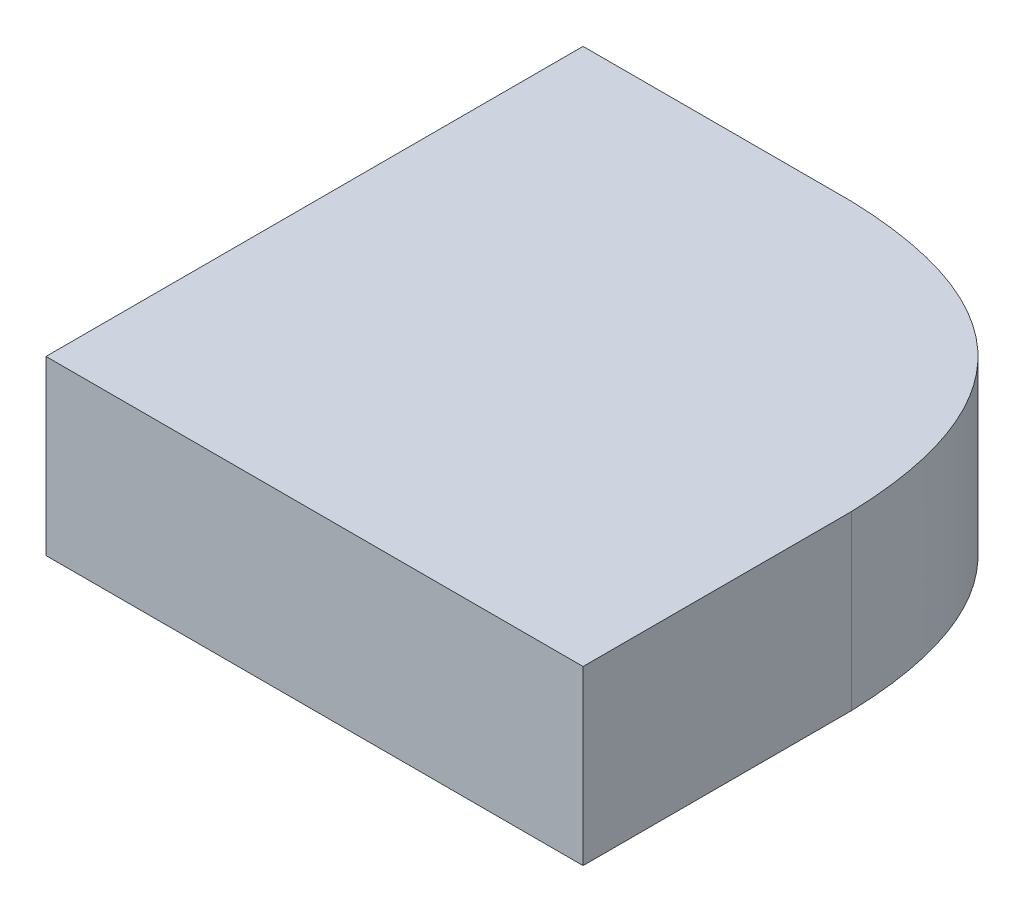
ISO-10303-21;
HEADER;
FILE_DESCRIPTION(('STEP AP214'),'2;1');
FILE_NAME('part.step','',(''),(''),'','','');
FILE_SCHEMA(('AUTOMOTIVE_DESIGN { 1 0 10303 214 1 1 1 1 }'));
ENDSEC;
DATA;
#1=APPLICATION_CONTEXT('core data for automotive mechanical design processes');
#2=APPLICATION_PROTOCOL_DEFINITION('international standard','automotive_design',2000,#1);
#3=PRODUCT_CONTEXT('',#1,'mechanical');
#4=PRODUCT('Part','Part','',(#3));
#5=PRODUCT_RELATED_PRODUCT_CATEGORY('part','',(#4));
#6=PRODUCT_DEFINITION_FORMATION('','',#4);
#7=PRODUCT_DEFINITION_CONTEXT('part definition',#1,'design');
#8=PRODUCT_DEFINITION('design','',#6,#7);
#9=PRODUCT_DEFINITION_SHAPE('','',#8);
#10=(LENGTH_UNIT() NAMED_UNIT(*) SI_UNIT(.MILLI.,.METRE.));
#11=(NAMED_UNIT(*) PLANE_ANGLE_UNIT() SI_UNIT($,.RADIAN.));
#12=(NAMED_UNIT(*) SI_UNIT($,.STERADIAN.) SOLID_ANGLE_UNIT());
#13=UNCERTAINTY_MEASURE_WITH_UNIT(LENGTH_MEASURE(1.E-05),#10,'distance_accuracy_value','');
#14=(GEOMETRIC_REPRESENTATION_CONTEXT(3) GLOBAL_UNCERTAINTY_ASSIGNED_CONTEXT((#13)) GLOBAL_UNIT_ASSIGNED_CONTEXT((#10,
#11,#12)) REPRESENTATION_CONTEXT('',''));
#15=CARTESIAN_POINT('',(0.,0.,0.));
#16=DIRECTION('',(0.,0.,1.));
#17=DIRECTION('',(1.,0.,0.));
#18=AXIS2_PLACEMENT_3D('',#15,#16,#17);
#19=CARTESIAN_POINT('',(12.4557692307692,8.,0.));
#20=CARTESIAN_POINT('',(12.0918378715965,8.,-12.0918378715965));
#21=CARTESIAN_POINT('',(0.,8.,-12.4557692307692));
#22=B_SPLINE_CURVE_WITH_KNOTS('',2,(#19,#20,#21),.UNSPECIFIED.,.F.,.F.,(3,3),(0.,1.),.UNSPECIFIED.);
#23=DIRECTION('',(0.,-1.,0.));
#24=VECTOR('',#23,1.);
#25=SURFACE_OF_LINEAR_EXTRUSION('',#22,#24);
#26=CARTESIAN_POINT('',(12.4557692307692,0.,0.));
#27=CARTESIAN_POINT('',(12.0918378715965,0.,-12.0918378715965));
#28=CARTESIAN_POINT('',(0.,0.,-12.4557692307692));
#29=B_SPLINE_CURVE_WITH_KNOTS('',2,(#26,#27,#28),.UNSPECIFIED.,.F.,.F.,(3,3),(0.,1.),.UNSPECIFIED.);
#30=CARTESIAN_POINT('',(12.4557692307692,0.,0.));
#31=VERTEX_POINT('',#30);
#32=CARTESIAN_POINT('',(0.,0.,-12.4557692307692));
#33=VERTEX_POINT('',#32);
#34=EDGE_CURVE('E123',#31,#33,#29,.T.);
#35=ORIENTED_EDGE('',*,*,#34,.T.);
#36=DIRECTION('',(0.,-1.,0.));
#37=VECTOR('',#36,1.);
#38=CARTESIAN_POINT('',(0.,8.,-12.4557692307692));
#39=LINE('',#38,#37);
#40=CARTESIAN_POINT('',(0.,8.,-12.4557692307692));
#41=VERTEX_POINT('',#40);
#42=EDGE_CURVE('E11',#41,#33,#39,.T.);
#43=ORIENTED_EDGE('',*,*,#42,.F.);
#44=CARTESIAN_POINT('',(12.4557692307692,8.,0.));
#45=VERTEX_POINT('',#44);
#46=EDGE_CURVE('E141',#45,#41,#22,.T.);
#47=ORIENTED_EDGE('',*,*,#46,.F.);
#48=DIRECTION('',(0.,-1.,0.));
#49=VECTOR('',#48,1.);
#50=CARTESIAN_POINT('',(12.4557692307692,8.,0.));
#51=LINE('',#50,#49);
#52=EDGE_CURVE('E119',#45,#31,#51,.T.);
#53=ORIENTED_EDGE('',*,*,#52,.T.);
#54=EDGE_LOOP('',(#35,#43,#47,#53));
#55=FACE_BOUND('',#54,.T.);
#56=ADVANCED_FACE('F43',(#55),#25,.F.);
#57=CARTESIAN_POINT('',(0.,8.,-12.4557692307692));
#58=DIRECTION('',(0.,0.,1.));
#59=DIRECTION('',(1.,0.,0.));
#60=AXIS2_PLACEMENT_3D('',#57,#58,#59);
#61=PLANE('',#60);
#62=DIRECTION('',(-1.,0.,0.));
#63=VECTOR('',#62,1.);
#64=CARTESIAN_POINT('',(0.,0.,-12.4557692307692));
#65=LINE('',#64,#63);
#66=CARTESIAN_POINT('',(-12.4557692307692,0.,-12.4557692307692));
#67=VERTEX_POINT('',#66);
#68=EDGE_CURVE('E129',#33,#67,#65,.T.);
#69=ORIENTED_EDGE('',*,*,#68,.T.);
#70=DIRECTION('',(0.,-1.,0.));
#71=VECTOR('',#70,1.);
#72=CARTESIAN_POINT('',(-12.4557692307692,8.,-12.4557692307692));
#73=LINE('',#72,#71);
#74=CARTESIAN_POINT('',(-12.4557692307692,8.,-12.4557692307692));
#75=VERTEX_POINT('',#74);
#76=EDGE_CURVE('E53',#75,#67,#73,.T.);
#77=ORIENTED_EDGE('',*,*,#76,.F.);
#78=DIRECTION('',(-1.,0.,0.));
#79=VECTOR('',#78,1.);
#80=CARTESIAN_POINT('',(0.,8.,-12.4557692307692));
#81=LINE('',#80,#79);
#82=EDGE_CURVE('E95',#41,#75,#81,.T.);
#83=ORIENTED_EDGE('',*,*,#82,.F.);
#84=ORIENTED_EDGE('',*,*,#42,.T.);
#85=EDGE_LOOP('',(#69,#77,#83,#84));
#86=FACE_BOUND('',#85,.T.);
#87=ADVANCED_FACE('F163',(#86),#61,.F.);
#88=CARTESIAN_POINT('',(-12.4557692307692,8.,12.4557692307692));
#89=DIRECTION('',(1.,0.,0.));
#90=DIRECTION('',(0.,0.,-1.));
#91=AXIS2_PLACEMENT_3D('',#88,#89,#90);
#92=PLANE('',#91);
#93=DIRECTION('',(0.,0.,1.));
#94=VECTOR('',#93,1.);
#95=CARTESIAN_POINT('',(-12.4557692307692,0.,12.4557692307692));
#96=LINE('',#95,#94);
#97=CARTESIAN_POINT('',(-12.4557692307692,0.,12.4557692307692));
#98=VERTEX_POINT('',#97);
#99=EDGE_CURVE('E111',#67,#98,#96,.T.);
#100=ORIENTED_EDGE('',*,*,#99,.T.);
#101=DIRECTION('',(0.,-1.,0.));
#102=VECTOR('',#101,1.);
#103=CARTESIAN_POINT('',(-12.4557692307692,8.,12.4557692307692));
#104=LINE('',#103,#102);
#105=CARTESIAN_POINT('',(-12.4557692307692,8.,12.4557692307692));
#106=VERTEX_POINT('',#105);
#107=EDGE_CURVE('E108',#106,#98,#104,.T.);
#108=ORIENTED_EDGE('',*,*,#107,.F.);
#109=DIRECTION('',(0.,0.,1.));
#110=VECTOR('',#109,1.);
#111=CARTESIAN_POINT('',(-12.4557692307692,8.,12.4557692307692));
#112=LINE('',#111,#110);
#113=EDGE_CURVE('E99',#75,#106,#112,.T.);
#114=ORIENTED_EDGE('',*,*,#113,.F.);
#115=ORIENTED_EDGE('',*,*,#76,.T.);
#116=EDGE_LOOP('',(#100,#108,#114,#115));
#117=FACE_BOUND('',#116,.T.);
#118=ADVANCED_FACE('F109',(#117),#92,.F.);
#119=CARTESIAN_POINT('',(12.4557692307692,8.,12.4557692307692));
#120=DIRECTION('',(0.,0.,-1.));
#121=DIRECTION('',(-1.,0.,0.));
#122=AXIS2_PLACEMENT_3D('',#119,#120,#121);
#123=PLANE('',#122);
#124=DIRECTION('',(1.,0.,0.));
#125=VECTOR('',#124,1.);
#126=CARTESIAN_POINT('',(12.4557692307692,0.,12.4557692307692));
#127=LINE('',#126,#125);
#128=CARTESIAN_POINT('',(12.4557692307692,0.,12.4557692307692));
#129=VERTEX_POINT('',#128);
#130=EDGE_CURVE('E81',#98,#129,#127,.T.);
#131=ORIENTED_EDGE('',*,*,#130,.T.);
#132=DIRECTION('',(0.,-1.,0.));
#133=VECTOR('',#132,1.);
#134=CARTESIAN_POINT('',(12.4557692307692,8.,12.4557692307692));
#135=LINE('',#134,#133);
#136=CARTESIAN_POINT('',(12.4557692307692,8.,12.4557692307692));
#137=VERTEX_POINT('',#136);
#138=EDGE_CURVE('E113',#137,#129,#135,.T.);
#139=ORIENTED_EDGE('',*,*,#138,.F.);
#140=DIRECTION('',(1.,0.,0.));
#141=VECTOR('',#140,1.);
#142=CARTESIAN_POINT('',(12.4557692307692,8.,12.4557692307692));
#143=LINE('',#142,#141);
#144=EDGE_CURVE('E103',#106,#137,#143,.T.);
#145=ORIENTED_EDGE('',*,*,#144,.F.);
#146=ORIENTED_EDGE('',*,*,#107,.T.);
#147=EDGE_LOOP('',(#131,#139,#145,#146));
#148=FACE_BOUND('',#147,.T.);
#149=ADVANCED_FACE('F115',(#148),#123,.F.);
#150=CARTESIAN_POINT('',(12.4557692307692,8.,0.));
#151=DIRECTION('',(-1.,0.,0.));
#152=DIRECTION('',(0.,0.,1.));
#153=AXIS2_PLACEMENT_3D('',#150,#151,#152);
#154=PLANE('',#153);
#155=DIRECTION('',(0.,0.,-1.));
#156=VECTOR('',#155,1.);
#157=CARTESIAN_POINT('',(12.4557692307692,0.,0.));
#158=LINE('',#157,#156);
#159=EDGE_CURVE('E87',#129,#31,#158,.T.);
#160=ORIENTED_EDGE('',*,*,#159,.T.);
#161=ORIENTED_EDGE('',*,*,#52,.F.);
#162=DIRECTION('',(0.,0.,-1.));
#163=VECTOR('',#162,1.);
#164=CARTESIAN_POINT('',(12.4557692307692,8.,0.));
#165=LINE('',#164,#163);
#166=EDGE_CURVE('E61',#137,#45,#165,.T.);
#167=ORIENTED_EDGE('',*,*,#166,.F.);
#168=ORIENTED_EDGE('',*,*,#138,.T.);
#169=EDGE_LOOP('',(#160,#161,#167,#168));
#170=FACE_BOUND('',#169,.T.);
#171=ADVANCED_FACE('F152',(#170),#154,.F.);
#172=CARTESIAN_POINT('',(9.15986124349054,8.,-9.15986124349054));
#173=DIRECTION('',(0.,1.,0.));
#174=DIRECTION('',(0.,0.,1.));
#175=AXIS2_PLACEMENT_3D('',#172,#173,#174);
#176=PLANE('',#175);
#177=ORIENTED_EDGE('',*,*,#46,.T.);
#178=ORIENTED_EDGE('',*,*,#82,.T.);
#179=ORIENTED_EDGE('',*,*,#113,.T.);
#180=ORIENTED_EDGE('',*,*,#144,.T.);
#181=ORIENTED_EDGE('',*,*,#166,.T.);
#182=EDGE_LOOP('',(#177,#178,#179,#180,#181));
#183=FACE_BOUND('',#182,.T.);
#184=ADVANCED_FACE('F101',(#183),#176,.T.);
#185=CARTESIAN_POINT('',(9.15986124349054,0.,-9.15986124349054));
#186=DIRECTION('',(0.,1.,0.));
#187=DIRECTION('',(0.,0.,1.));
#188=AXIS2_PLACEMENT_3D('',#185,#186,#187);
#189=PLANE('',#188);
#190=ORIENTED_EDGE('',*,*,#34,.F.);
#191=ORIENTED_EDGE('',*,*,#159,.F.);
#192=ORIENTED_EDGE('',*,*,#130,.F.);
#193=ORIENTED_EDGE('',*,*,#99,.F.);
#194=ORIENTED_EDGE('',*,*,#68,.F.);
#195=EDGE_LOOP('',(#190,#191,#192,#193,#194));
#196=FACE_BOUND('',#195,.T.);
#197=ADVANCED_FACE('F148',(#196),#189,.F.);
#198=CLOSED_SHELL('',(#56,#87,#118,#149,#171,#184,#197));
#199=MANIFOLD_SOLID_BREP('B2',#198);
#200=ADVANCED_BREP_SHAPE_REPRESENTATION('',(#18,#199),#14);
#201=SHAPE_DEFINITION_REPRESENTATION(#9,#200);
ENDSEC;
END-ISO-10303-21;
